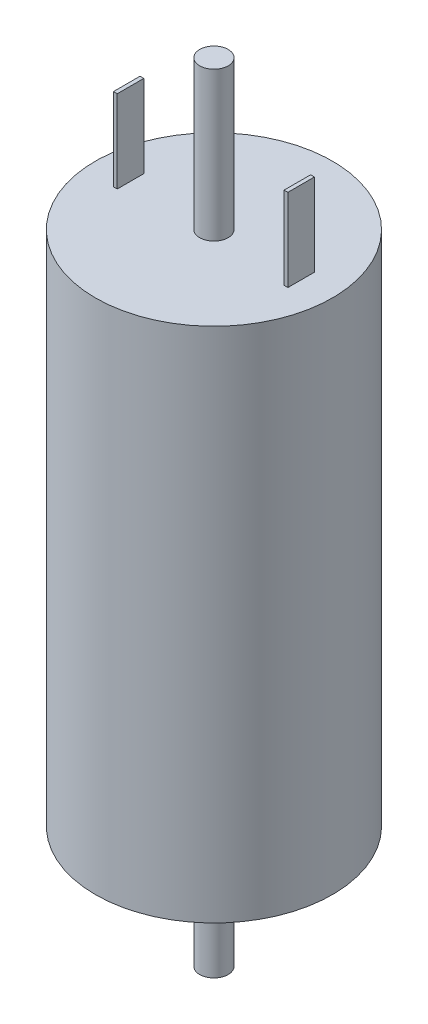
ISO-10303-21;
HEADER;
FILE_DESCRIPTION(('STEP AP214'),'2;1');
FILE_NAME('part.step','',(''),(''),'','','');
FILE_SCHEMA(('AUTOMOTIVE_DESIGN { 1 0 10303 214 1 1 1 1 }'));
ENDSEC;
DATA;
#1=APPLICATION_CONTEXT('core data for automotive mechanical design processes');
#2=APPLICATION_PROTOCOL_DEFINITION('international standard','automotive_design',2000,#1);
#3=PRODUCT_CONTEXT('',#1,'mechanical');
#4=PRODUCT('Part','Part','',(#3));
#5=PRODUCT_RELATED_PRODUCT_CATEGORY('part','',(#4));
#6=PRODUCT_DEFINITION_FORMATION('','',#4);
#7=PRODUCT_DEFINITION_CONTEXT('part definition',#1,'design');
#8=PRODUCT_DEFINITION('design','',#6,#7);
#9=PRODUCT_DEFINITION_SHAPE('','',#8);
#10=(LENGTH_UNIT() NAMED_UNIT(*) SI_UNIT(.MILLI.,.METRE.));
#11=(NAMED_UNIT(*) PLANE_ANGLE_UNIT() SI_UNIT($,.RADIAN.));
#12=(NAMED_UNIT(*) SI_UNIT($,.STERADIAN.) SOLID_ANGLE_UNIT());
#13=UNCERTAINTY_MEASURE_WITH_UNIT(LENGTH_MEASURE(1.E-05),#10,'distance_accuracy_value','');
#14=(GEOMETRIC_REPRESENTATION_CONTEXT(3) GLOBAL_UNCERTAINTY_ASSIGNED_CONTEXT((#13)) GLOBAL_UNIT_ASSIGNED_CONTEXT((#10,
#11,#12)) REPRESENTATION_CONTEXT('',''));
#15=CARTESIAN_POINT('',(0.,0.,0.));
#16=DIRECTION('',(0.,0.,1.));
#17=DIRECTION('',(1.,0.,0.));
#18=AXIS2_PLACEMENT_3D('',#15,#16,#17);
#19=CARTESIAN_POINT('',(0.,-54.5,0.));
#20=DIRECTION('',(0.,1.,0.));
#21=DIRECTION('',(0.,0.,1.));
#22=AXIS2_PLACEMENT_3D('',#19,#20,#21);
#23=PLANE('',#22);
#24=CARTESIAN_POINT('',(0.,-54.5,0.));
#25=DIRECTION('',(0.,1.,0.));
#26=DIRECTION('',(0.,0.,1.));
#27=AXIS2_PLACEMENT_3D('',#24,#25,#26);
#28=CIRCLE('',#27,12.5);
#29=CARTESIAN_POINT('',(0.,-54.5,12.5));
#30=VERTEX_POINT('',#29);
#31=EDGE_CURVE('E41',#30,#30,#28,.T.);
#32=ORIENTED_EDGE('',*,*,#31,.F.);
#33=EDGE_LOOP('',(#32));
#34=FACE_BOUND('',#33,.T.);
#35=CARTESIAN_POINT('',(0.,-54.5,8.5));
#36=DIRECTION('',(0.,-1.,0.));
#37=DIRECTION('',(0.,0.,-1.));
#38=AXIS2_PLACEMENT_3D('',#35,#36,#37);
#39=CIRCLE('',#38,1.);
#40=CARTESIAN_POINT('',(0.,-54.5,7.5));
#41=VERTEX_POINT('',#40);
#42=EDGE_CURVE('E194',#41,#41,#39,.T.);
#43=ORIENTED_EDGE('',*,*,#42,.F.);
#44=EDGE_LOOP('',(#43));
#45=FACE_BOUND('',#44,.T.);
#46=CARTESIAN_POINT('',(0.,-54.5,-8.5));
#47=DIRECTION('',(0.,-1.,0.));
#48=DIRECTION('',(0.,0.,-1.));
#49=AXIS2_PLACEMENT_3D('',#46,#47,#48);
#50=CIRCLE('',#49,1.);
#51=CARTESIAN_POINT('',(0.,-54.5,-9.5));
#52=VERTEX_POINT('',#51);
#53=EDGE_CURVE('E188',#52,#52,#50,.T.);
#54=ORIENTED_EDGE('',*,*,#53,.F.);
#55=EDGE_LOOP('',(#54));
#56=FACE_BOUND('',#55,.T.);
#57=CARTESIAN_POINT('',(-7.36121593216774,-54.5,-4.24999999999998));
#58=DIRECTION('',(0.,-1.,0.));
#59=DIRECTION('',(0.,0.,-1.));
#60=AXIS2_PLACEMENT_3D('',#57,#58,#59);
#61=CIRCLE('',#60,1.);
#62=CARTESIAN_POINT('',(-7.36121593216774,-54.5,-5.24999999999998));
#63=VERTEX_POINT('',#62);
#64=EDGE_CURVE('E183',#63,#63,#61,.T.);
#65=ORIENTED_EDGE('',*,*,#64,.F.);
#66=EDGE_LOOP('',(#65));
#67=FACE_BOUND('',#66,.T.);
#68=CARTESIAN_POINT('',(7.36121593216774,-54.5,-4.24999999999998));
#69=DIRECTION('',(0.,-1.,0.));
#70=DIRECTION('',(0.,0.,1.));
#71=AXIS2_PLACEMENT_3D('',#68,#69,#70);
#72=CIRCLE('',#71,1.);
#73=CARTESIAN_POINT('',(7.36121593216774,-54.5,-3.24999999999998));
#74=VERTEX_POINT('',#73);
#75=EDGE_CURVE('E170',#74,#74,#72,.T.);
#76=ORIENTED_EDGE('',*,*,#75,.F.);
#77=EDGE_LOOP('',(#76));
#78=FACE_BOUND('',#77,.T.);
#79=CARTESIAN_POINT('',(0.,-54.5,0.));
#80=DIRECTION('',(0.,1.,0.));
#81=DIRECTION('',(0.,0.,1.));
#82=AXIS2_PLACEMENT_3D('',#79,#80,#81);
#83=CIRCLE('',#82,5.);
#84=CARTESIAN_POINT('',(0.,-54.5,5.));
#85=VERTEX_POINT('',#84);
#86=EDGE_CURVE('E11',#85,#85,#83,.F.);
#87=ORIENTED_EDGE('',*,*,#86,.F.);
#88=EDGE_LOOP('',(#87));
#89=FACE_BOUND('',#88,.T.);
#90=ADVANCED_FACE('F33',(#34,#45,#56,#67,#78,#89),#23,.F.);
#91=CARTESIAN_POINT('',(0.,0.,0.));
#92=DIRECTION('',(0.,1.,0.));
#93=DIRECTION('',(0.,0.,1.));
#94=AXIS2_PLACEMENT_3D('',#91,#92,#93);
#95=PLANE('',#94);
#96=DIRECTION('',(-1.,0.,0.));
#97=VECTOR('',#96,1.);
#98=CARTESIAN_POINT('',(8.8,0.,-1.39999999999999));
#99=LINE('',#98,#97);
#100=CARTESIAN_POINT('',(9.2,0.,-1.39999999999999));
#101=VERTEX_POINT('',#100);
#102=CARTESIAN_POINT('',(8.8,0.,-1.39999999999999));
#103=VERTEX_POINT('',#102);
#104=EDGE_CURVE('E127',#101,#103,#99,.T.);
#105=ORIENTED_EDGE('',*,*,#104,.F.);
#106=DIRECTION('',(0.,0.,-1.));
#107=VECTOR('',#106,1.);
#108=CARTESIAN_POINT('',(9.2,0.,1.40000000000001));
#109=LINE('',#108,#107);
#110=CARTESIAN_POINT('',(9.2,0.,1.40000000000001));
#111=VERTEX_POINT('',#110);
#112=EDGE_CURVE('E124',#111,#101,#109,.T.);
#113=ORIENTED_EDGE('',*,*,#112,.F.);
#114=DIRECTION('',(1.,0.,0.));
#115=VECTOR('',#114,1.);
#116=CARTESIAN_POINT('',(8.8,0.,1.40000000000001));
#117=LINE('',#116,#115);
#118=CARTESIAN_POINT('',(8.8,0.,1.40000000000001));
#119=VERTEX_POINT('',#118);
#120=EDGE_CURVE('E136',#119,#111,#117,.T.);
#121=ORIENTED_EDGE('',*,*,#120,.F.);
#122=DIRECTION('',(0.,0.,1.));
#123=VECTOR('',#122,1.);
#124=CARTESIAN_POINT('',(8.8,0.,1.40000000000001));
#125=LINE('',#124,#123);
#126=EDGE_CURVE('E144',#103,#119,#125,.T.);
#127=ORIENTED_EDGE('',*,*,#126,.F.);
#128=EDGE_LOOP('',(#105,#113,#121,#127));
#129=FACE_BOUND('',#128,.T.);
#130=CARTESIAN_POINT('',(0.,0.,0.));
#131=DIRECTION('',(0.,1.,0.));
#132=DIRECTION('',(0.,0.,1.));
#133=AXIS2_PLACEMENT_3D('',#130,#131,#132);
#134=CIRCLE('',#133,12.5);
#135=CARTESIAN_POINT('',(0.,0.,12.5));
#136=VERTEX_POINT('',#135);
#137=EDGE_CURVE('E164',#136,#136,#134,.T.);
#138=ORIENTED_EDGE('',*,*,#137,.T.);
#139=EDGE_LOOP('',(#138));
#140=FACE_BOUND('',#139,.T.);
#141=CARTESIAN_POINT('',(0.,0.,0.));
#142=DIRECTION('',(0.,1.,0.));
#143=DIRECTION('',(0.,0.,1.));
#144=AXIS2_PLACEMENT_3D('',#141,#142,#143);
#145=CIRCLE('',#144,1.5);
#146=CARTESIAN_POINT('',(0.,0.,1.5));
#147=VERTEX_POINT('',#146);
#148=EDGE_CURVE('E155',#147,#147,#145,.T.);
#149=ORIENTED_EDGE('',*,*,#148,.F.);
#150=EDGE_LOOP('',(#149));
#151=FACE_BOUND('',#150,.T.);
#152=DIRECTION('',(0.,0.,-1.));
#153=VECTOR('',#152,1.);
#154=CARTESIAN_POINT('',(-8.8,0.,1.40000000000001));
#155=LINE('',#154,#153);
#156=CARTESIAN_POINT('',(-8.8,0.,1.40000000000001));
#157=VERTEX_POINT('',#156);
#158=CARTESIAN_POINT('',(-8.8,0.,-1.39999999999999));
#159=VERTEX_POINT('',#158);
#160=EDGE_CURVE('E206',#157,#159,#155,.T.);
#161=ORIENTED_EDGE('',*,*,#160,.F.);
#162=DIRECTION('',(1.,0.,0.));
#163=VECTOR('',#162,1.);
#164=CARTESIAN_POINT('',(-8.8,0.,1.40000000000001));
#165=LINE('',#164,#163);
#166=CARTESIAN_POINT('',(-9.2,0.,1.40000000000001));
#167=VERTEX_POINT('',#166);
#168=EDGE_CURVE('E122',#167,#157,#165,.T.);
#169=ORIENTED_EDGE('',*,*,#168,.F.);
#170=DIRECTION('',(0.,0.,1.));
#171=VECTOR('',#170,1.);
#172=CARTESIAN_POINT('',(-9.2,0.,1.40000000000001));
#173=LINE('',#172,#171);
#174=CARTESIAN_POINT('',(-9.2,0.,-1.39999999999999));
#175=VERTEX_POINT('',#174);
#176=EDGE_CURVE('E118',#175,#167,#173,.T.);
#177=ORIENTED_EDGE('',*,*,#176,.F.);
#178=DIRECTION('',(-1.,0.,0.));
#179=VECTOR('',#178,1.);
#180=CARTESIAN_POINT('',(-8.8,0.,-1.39999999999999));
#181=LINE('',#180,#179);
#182=EDGE_CURVE('E208',#159,#175,#181,.T.);
#183=ORIENTED_EDGE('',*,*,#182,.F.);
#184=EDGE_LOOP('',(#161,#169,#177,#183));
#185=FACE_BOUND('',#184,.T.);
#186=ADVANCED_FACE('F213',(#129,#140,#151,#185),#95,.T.);
#187=CARTESIAN_POINT('',(0.,-54.5,0.));
#188=DIRECTION('',(0.,1.,0.));
#189=DIRECTION('',(0.,0.,1.));
#190=AXIS2_PLACEMENT_3D('',#187,#188,#189);
#191=CYLINDRICAL_SURFACE('',#190,12.5);
#192=ORIENTED_EDGE('',*,*,#31,.T.);
#193=EDGE_LOOP('',(#192));
#194=FACE_BOUND('',#193,.T.);
#195=ORIENTED_EDGE('',*,*,#137,.F.);
#196=EDGE_LOOP('',(#195));
#197=FACE_BOUND('',#196,.T.);
#198=ADVANCED_FACE('F35',(#194,#197),#191,.T.);
#199=CARTESIAN_POINT('',(0.,15.7,0.));
#200=DIRECTION('',(0.,-1.,0.));
#201=DIRECTION('',(0.,0.,-1.));
#202=AXIS2_PLACEMENT_3D('',#199,#200,#201);
#203=CYLINDRICAL_SURFACE('',#202,1.5);
#204=CARTESIAN_POINT('',(0.,15.7,0.));
#205=DIRECTION('',(0.,1.,0.));
#206=DIRECTION('',(0.,0.,1.));
#207=AXIS2_PLACEMENT_3D('',#204,#205,#206);
#208=CIRCLE('',#207,1.5);
#209=CARTESIAN_POINT('',(0.,15.7,1.5));
#210=VERTEX_POINT('',#209);
#211=EDGE_CURVE('E156',#210,#210,#208,.T.);
#212=ORIENTED_EDGE('',*,*,#211,.F.);
#213=EDGE_LOOP('',(#212));
#214=FACE_BOUND('',#213,.T.);
#215=ORIENTED_EDGE('',*,*,#148,.T.);
#216=EDGE_LOOP('',(#215));
#217=FACE_BOUND('',#216,.T.);
#218=ADVANCED_FACE('F247',(#214,#217),#203,.T.);
#219=CARTESIAN_POINT('',(0.,15.7,0.));
#220=DIRECTION('',(0.,1.,0.));
#221=DIRECTION('',(0.,0.,1.));
#222=AXIS2_PLACEMENT_3D('',#219,#220,#221);
#223=PLANE('',#222);
#224=ORIENTED_EDGE('',*,*,#211,.T.);
#225=EDGE_LOOP('',(#224));
#226=FACE_BOUND('',#225,.T.);
#227=ADVANCED_FACE('F250',(#226),#223,.T.);
#228=CARTESIAN_POINT('',(9.2,8.7,1.40000000000001));
#229=DIRECTION('',(-1.,0.,0.));
#230=DIRECTION('',(0.,0.,1.));
#231=AXIS2_PLACEMENT_3D('',#228,#229,#230);
#232=PLANE('',#231);
#233=ORIENTED_EDGE('',*,*,#112,.T.);
#234=DIRECTION('',(0.,-1.,0.));
#235=VECTOR('',#234,1.);
#236=CARTESIAN_POINT('',(9.2,8.7,-1.39999999999999));
#237=LINE('',#236,#235);
#238=CARTESIAN_POINT('',(9.2,8.7,-1.39999999999999));
#239=VERTEX_POINT('',#238);
#240=EDGE_CURVE('E153',#239,#101,#237,.T.);
#241=ORIENTED_EDGE('',*,*,#240,.F.);
#242=DIRECTION('',(0.,0.,-1.));
#243=VECTOR('',#242,1.);
#244=CARTESIAN_POINT('',(9.2,8.7,1.40000000000001));
#245=LINE('',#244,#243);
#246=CARTESIAN_POINT('',(9.2,8.7,1.40000000000001));
#247=VERTEX_POINT('',#246);
#248=EDGE_CURVE('E132',#247,#239,#245,.T.);
#249=ORIENTED_EDGE('',*,*,#248,.F.);
#250=DIRECTION('',(0.,-1.,0.));
#251=VECTOR('',#250,1.);
#252=CARTESIAN_POINT('',(9.2,8.7,1.40000000000001));
#253=LINE('',#252,#251);
#254=EDGE_CURVE('E141',#247,#111,#253,.T.);
#255=ORIENTED_EDGE('',*,*,#254,.T.);
#256=EDGE_LOOP('',(#233,#241,#249,#255));
#257=FACE_BOUND('',#256,.T.);
#258=ADVANCED_FACE('F254',(#257),#232,.F.);
#259=CARTESIAN_POINT('',(8.8,8.7,-1.39999999999999));
#260=DIRECTION('',(0.,0.,1.));
#261=DIRECTION('',(1.,0.,0.));
#262=AXIS2_PLACEMENT_3D('',#259,#260,#261);
#263=PLANE('',#262);
#264=ORIENTED_EDGE('',*,*,#104,.T.);
#265=DIRECTION('',(0.,-1.,0.));
#266=VECTOR('',#265,1.);
#267=CARTESIAN_POINT('',(8.8,8.7,-1.39999999999999));
#268=LINE('',#267,#266);
#269=CARTESIAN_POINT('',(8.8,8.7,-1.39999999999999));
#270=VERTEX_POINT('',#269);
#271=EDGE_CURVE('E150',#270,#103,#268,.T.);
#272=ORIENTED_EDGE('',*,*,#271,.F.);
#273=DIRECTION('',(-1.,0.,0.));
#274=VECTOR('',#273,1.);
#275=CARTESIAN_POINT('',(8.8,8.7,-1.39999999999999));
#276=LINE('',#275,#274);
#277=EDGE_CURVE('E135',#239,#270,#276,.T.);
#278=ORIENTED_EDGE('',*,*,#277,.F.);
#279=ORIENTED_EDGE('',*,*,#240,.T.);
#280=EDGE_LOOP('',(#264,#272,#278,#279));
#281=FACE_BOUND('',#280,.T.);
#282=ADVANCED_FACE('F258',(#281),#263,.F.);
#283=CARTESIAN_POINT('',(8.8,8.7,1.40000000000001));
#284=DIRECTION('',(1.,0.,0.));
#285=DIRECTION('',(0.,0.,-1.));
#286=AXIS2_PLACEMENT_3D('',#283,#284,#285);
#287=PLANE('',#286);
#288=ORIENTED_EDGE('',*,*,#126,.T.);
#289=DIRECTION('',(0.,-1.,0.));
#290=VECTOR('',#289,1.);
#291=CARTESIAN_POINT('',(8.8,8.7,1.40000000000001));
#292=LINE('',#291,#290);
#293=CARTESIAN_POINT('',(8.8,8.7,1.40000000000001));
#294=VERTEX_POINT('',#293);
#295=EDGE_CURVE('E56',#294,#119,#292,.T.);
#296=ORIENTED_EDGE('',*,*,#295,.F.);
#297=DIRECTION('',(0.,0.,1.));
#298=VECTOR('',#297,1.);
#299=CARTESIAN_POINT('',(8.8,8.7,1.40000000000001));
#300=LINE('',#299,#298);
#301=EDGE_CURVE('E138',#270,#294,#300,.T.);
#302=ORIENTED_EDGE('',*,*,#301,.F.);
#303=ORIENTED_EDGE('',*,*,#271,.T.);
#304=EDGE_LOOP('',(#288,#296,#302,#303));
#305=FACE_BOUND('',#304,.T.);
#306=ADVANCED_FACE('F262',(#305),#287,.F.);
#307=CARTESIAN_POINT('',(8.8,8.7,1.40000000000001));
#308=DIRECTION('',(0.,0.,-1.));
#309=DIRECTION('',(-1.,0.,0.));
#310=AXIS2_PLACEMENT_3D('',#307,#308,#309);
#311=PLANE('',#310);
#312=ORIENTED_EDGE('',*,*,#120,.T.);
#313=ORIENTED_EDGE('',*,*,#254,.F.);
#314=DIRECTION('',(1.,0.,0.));
#315=VECTOR('',#314,1.);
#316=CARTESIAN_POINT('',(8.8,8.7,1.40000000000001));
#317=LINE('',#316,#315);
#318=EDGE_CURVE('E140',#294,#247,#317,.T.);
#319=ORIENTED_EDGE('',*,*,#318,.F.);
#320=ORIENTED_EDGE('',*,*,#295,.T.);
#321=EDGE_LOOP('',(#312,#313,#319,#320));
#322=FACE_BOUND('',#321,.T.);
#323=ADVANCED_FACE('F266',(#322),#311,.F.);
#324=CARTESIAN_POINT('',(0.,8.7,0.));
#325=DIRECTION('',(0.,-1.,0.));
#326=DIRECTION('',(0.,0.,-1.));
#327=AXIS2_PLACEMENT_3D('',#324,#325,#326);
#328=PLANE('',#327);
#329=ORIENTED_EDGE('',*,*,#248,.T.);
#330=ORIENTED_EDGE('',*,*,#277,.T.);
#331=ORIENTED_EDGE('',*,*,#301,.T.);
#332=ORIENTED_EDGE('',*,*,#318,.T.);
#333=EDGE_LOOP('',(#329,#330,#331,#332));
#334=FACE_BOUND('',#333,.T.);
#335=ADVANCED_FACE('F270',(#334),#328,.F.);
#336=CARTESIAN_POINT('',(-8.8,8.7,1.40000000000001));
#337=DIRECTION('',(0.,0.,-1.));
#338=DIRECTION('',(-1.,0.,0.));
#339=AXIS2_PLACEMENT_3D('',#336,#337,#338);
#340=PLANE('',#339);
#341=ORIENTED_EDGE('',*,*,#168,.T.);
#342=DIRECTION('',(0.,-1.,0.));
#343=VECTOR('',#342,1.);
#344=CARTESIAN_POINT('',(-8.8,8.7,1.40000000000001));
#345=LINE('',#344,#343);
#346=CARTESIAN_POINT('',(-8.8,8.7,1.40000000000001));
#347=VERTEX_POINT('',#346);
#348=EDGE_CURVE('E103',#347,#157,#345,.T.);
#349=ORIENTED_EDGE('',*,*,#348,.F.);
#350=DIRECTION('',(1.,0.,0.));
#351=VECTOR('',#350,1.);
#352=CARTESIAN_POINT('',(-8.8,8.7,1.40000000000001));
#353=LINE('',#352,#351);
#354=CARTESIAN_POINT('',(-9.2,8.7,1.40000000000001));
#355=VERTEX_POINT('',#354);
#356=EDGE_CURVE('E110',#355,#347,#353,.T.);
#357=ORIENTED_EDGE('',*,*,#356,.F.);
#358=DIRECTION('',(0.,-1.,0.));
#359=VECTOR('',#358,1.);
#360=CARTESIAN_POINT('',(-9.2,8.7,1.40000000000001));
#361=LINE('',#360,#359);
#362=EDGE_CURVE('E204',#355,#167,#361,.T.);
#363=ORIENTED_EDGE('',*,*,#362,.T.);
#364=EDGE_LOOP('',(#341,#349,#357,#363));
#365=FACE_BOUND('',#364,.T.);
#366=ADVANCED_FACE('F120',(#365),#340,.F.);
#367=CARTESIAN_POINT('',(-8.8,8.7,1.40000000000001));
#368=DIRECTION('',(-1.,0.,0.));
#369=DIRECTION('',(0.,0.,1.));
#370=AXIS2_PLACEMENT_3D('',#367,#368,#369);
#371=PLANE('',#370);
#372=ORIENTED_EDGE('',*,*,#160,.T.);
#373=DIRECTION('',(0.,-1.,0.));
#374=VECTOR('',#373,1.);
#375=CARTESIAN_POINT('',(-8.8,8.7,-1.39999999999999));
#376=LINE('',#375,#374);
#377=CARTESIAN_POINT('',(-8.8,8.7,-1.39999999999999));
#378=VERTEX_POINT('',#377);
#379=EDGE_CURVE('E106',#378,#159,#376,.T.);
#380=ORIENTED_EDGE('',*,*,#379,.F.);
#381=DIRECTION('',(0.,0.,-1.));
#382=VECTOR('',#381,1.);
#383=CARTESIAN_POINT('',(-8.8,8.7,1.40000000000001));
#384=LINE('',#383,#382);
#385=EDGE_CURVE('E99',#347,#378,#384,.T.);
#386=ORIENTED_EDGE('',*,*,#385,.F.);
#387=ORIENTED_EDGE('',*,*,#348,.T.);
#388=EDGE_LOOP('',(#372,#380,#386,#387));
#389=FACE_BOUND('',#388,.T.);
#390=ADVANCED_FACE('F101',(#389),#371,.F.);
#391=CARTESIAN_POINT('',(-8.8,8.7,-1.39999999999999));
#392=DIRECTION('',(0.,0.,1.));
#393=DIRECTION('',(1.,0.,0.));
#394=AXIS2_PLACEMENT_3D('',#391,#392,#393);
#395=PLANE('',#394);
#396=ORIENTED_EDGE('',*,*,#182,.T.);
#397=DIRECTION('',(0.,-1.,0.));
#398=VECTOR('',#397,1.);
#399=CARTESIAN_POINT('',(-9.2,8.7,-1.39999999999999));
#400=LINE('',#399,#398);
#401=CARTESIAN_POINT('',(-9.2,8.7,-1.39999999999999));
#402=VERTEX_POINT('',#401);
#403=EDGE_CURVE('E48',#402,#175,#400,.T.);
#404=ORIENTED_EDGE('',*,*,#403,.F.);
#405=DIRECTION('',(-1.,0.,0.));
#406=VECTOR('',#405,1.);
#407=CARTESIAN_POINT('',(-8.8,8.7,-1.39999999999999));
#408=LINE('',#407,#406);
#409=EDGE_CURVE('E109',#378,#402,#408,.T.);
#410=ORIENTED_EDGE('',*,*,#409,.F.);
#411=ORIENTED_EDGE('',*,*,#379,.T.);
#412=EDGE_LOOP('',(#396,#404,#410,#411));
#413=FACE_BOUND('',#412,.T.);
#414=ADVANCED_FACE('F216',(#413),#395,.F.);
#415=CARTESIAN_POINT('',(-9.2,8.7,1.40000000000001));
#416=DIRECTION('',(1.,0.,0.));
#417=DIRECTION('',(0.,0.,-1.));
#418=AXIS2_PLACEMENT_3D('',#415,#416,#417);
#419=PLANE('',#418);
#420=ORIENTED_EDGE('',*,*,#176,.T.);
#421=ORIENTED_EDGE('',*,*,#362,.F.);
#422=DIRECTION('',(0.,0.,1.));
#423=VECTOR('',#422,1.);
#424=CARTESIAN_POINT('',(-9.2,8.7,1.40000000000001));
#425=LINE('',#424,#423);
#426=EDGE_CURVE('E114',#402,#355,#425,.T.);
#427=ORIENTED_EDGE('',*,*,#426,.F.);
#428=ORIENTED_EDGE('',*,*,#403,.T.);
#429=EDGE_LOOP('',(#420,#421,#427,#428));
#430=FACE_BOUND('',#429,.T.);
#431=ADVANCED_FACE('F217',(#430),#419,.F.);
#432=CARTESIAN_POINT('',(0.,8.7,0.));
#433=DIRECTION('',(0.,-1.,0.));
#434=DIRECTION('',(0.,0.,-1.));
#435=AXIS2_PLACEMENT_3D('',#432,#433,#434);
#436=PLANE('',#435);
#437=ORIENTED_EDGE('',*,*,#356,.T.);
#438=ORIENTED_EDGE('',*,*,#385,.T.);
#439=ORIENTED_EDGE('',*,*,#409,.T.);
#440=ORIENTED_EDGE('',*,*,#426,.T.);
#441=EDGE_LOOP('',(#437,#438,#439,#440));
#442=FACE_BOUND('',#441,.T.);
#443=ADVANCED_FACE('F113',(#442),#436,.F.);
#444=CARTESIAN_POINT('',(0.,-51.6,8.5));
#445=DIRECTION('',(0.,-1.,0.));
#446=DIRECTION('',(0.,0.,-1.));
#447=AXIS2_PLACEMENT_3D('',#444,#445,#446);
#448=CYLINDRICAL_SURFACE('',#447,1.);
#449=CARTESIAN_POINT('',(0.,-51.6,8.5));
#450=DIRECTION('',(0.,-1.,0.));
#451=DIRECTION('',(0.,0.,-1.));
#452=AXIS2_PLACEMENT_3D('',#449,#450,#451);
#453=CIRCLE('',#452,1.);
#454=CARTESIAN_POINT('',(0.,-51.6,7.5));
#455=VERTEX_POINT('',#454);
#456=EDGE_CURVE('E197',#455,#455,#453,.T.);
#457=ORIENTED_EDGE('',*,*,#456,.F.);
#458=EDGE_LOOP('',(#457));
#459=FACE_BOUND('',#458,.T.);
#460=ORIENTED_EDGE('',*,*,#42,.T.);
#461=EDGE_LOOP('',(#460));
#462=FACE_BOUND('',#461,.T.);
#463=ADVANCED_FACE('F224',(#459,#462),#448,.F.);
#464=CARTESIAN_POINT('',(0.,-51.6,8.5));
#465=DIRECTION('',(0.,-1.,0.));
#466=DIRECTION('',(0.,0.,-1.));
#467=AXIS2_PLACEMENT_3D('',#464,#465,#466);
#468=PLANE('',#467);
#469=ORIENTED_EDGE('',*,*,#456,.T.);
#470=EDGE_LOOP('',(#469));
#471=FACE_BOUND('',#470,.T.);
#472=ADVANCED_FACE('F304',(#471),#468,.T.);
#473=CARTESIAN_POINT('',(0.,-51.6,-8.5));
#474=DIRECTION('',(0.,-1.,0.));
#475=DIRECTION('',(0.,0.,-1.));
#476=AXIS2_PLACEMENT_3D('',#473,#474,#475);
#477=CYLINDRICAL_SURFACE('',#476,1.);
#478=CARTESIAN_POINT('',(0.,-51.6,-8.5));
#479=DIRECTION('',(0.,-1.,0.));
#480=DIRECTION('',(0.,0.,-1.));
#481=AXIS2_PLACEMENT_3D('',#478,#479,#480);
#482=CIRCLE('',#481,1.);
#483=CARTESIAN_POINT('',(0.,-51.6,-9.5));
#484=VERTEX_POINT('',#483);
#485=EDGE_CURVE('E191',#484,#484,#482,.T.);
#486=ORIENTED_EDGE('',*,*,#485,.F.);
#487=EDGE_LOOP('',(#486));
#488=FACE_BOUND('',#487,.T.);
#489=ORIENTED_EDGE('',*,*,#53,.T.);
#490=EDGE_LOOP('',(#489));
#491=FACE_BOUND('',#490,.T.);
#492=ADVANCED_FACE('F314',(#488,#491),#477,.F.);
#493=CARTESIAN_POINT('',(0.,-51.6,-8.5));
#494=DIRECTION('',(0.,-1.,0.));
#495=DIRECTION('',(0.,0.,-1.));
#496=AXIS2_PLACEMENT_3D('',#493,#494,#495);
#497=PLANE('',#496);
#498=ORIENTED_EDGE('',*,*,#485,.T.);
#499=EDGE_LOOP('',(#498));
#500=FACE_BOUND('',#499,.T.);
#501=ADVANCED_FACE('F324',(#500),#497,.T.);
#502=CARTESIAN_POINT('',(-7.36121593216774,-51.6,-4.24999999999998));
#503=DIRECTION('',(0.,-1.,0.));
#504=DIRECTION('',(0.,0.,-1.));
#505=AXIS2_PLACEMENT_3D('',#502,#503,#504);
#506=CYLINDRICAL_SURFACE('',#505,1.);
#507=CARTESIAN_POINT('',(-7.36121593216774,-51.6,-4.24999999999998));
#508=DIRECTION('',(0.,-1.,0.));
#509=DIRECTION('',(0.,0.,-1.));
#510=AXIS2_PLACEMENT_3D('',#507,#508,#509);
#511=CIRCLE('',#510,1.);
#512=CARTESIAN_POINT('',(-7.36121593216774,-51.6,-5.24999999999998));
#513=VERTEX_POINT('',#512);
#514=EDGE_CURVE('E185',#513,#513,#511,.T.);
#515=ORIENTED_EDGE('',*,*,#514,.F.);
#516=EDGE_LOOP('',(#515));
#517=FACE_BOUND('',#516,.T.);
#518=ORIENTED_EDGE('',*,*,#64,.T.);
#519=EDGE_LOOP('',(#518));
#520=FACE_BOUND('',#519,.T.);
#521=ADVANCED_FACE('F334',(#517,#520),#506,.F.);
#522=CARTESIAN_POINT('',(-7.36121593216774,-51.6,-4.24999999999998));
#523=DIRECTION('',(0.,-1.,0.));
#524=DIRECTION('',(0.,0.,-1.));
#525=AXIS2_PLACEMENT_3D('',#522,#523,#524);
#526=PLANE('',#525);
#527=ORIENTED_EDGE('',*,*,#514,.T.);
#528=EDGE_LOOP('',(#527));
#529=FACE_BOUND('',#528,.T.);
#530=ADVANCED_FACE('F344',(#529),#526,.T.);
#531=CARTESIAN_POINT('',(7.36121593216774,-51.6,-4.24999999999998));
#532=DIRECTION('',(0.,-1.,0.));
#533=DIRECTION('',(0.,0.,-1.));
#534=AXIS2_PLACEMENT_3D('',#531,#532,#533);
#535=CYLINDRICAL_SURFACE('',#534,1.);
#536=CARTESIAN_POINT('',(7.36121593216774,-51.6,-4.24999999999998));
#537=DIRECTION('',(0.,-1.,0.));
#538=DIRECTION('',(0.,0.,1.));
#539=AXIS2_PLACEMENT_3D('',#536,#537,#538);
#540=CIRCLE('',#539,1.);
#541=CARTESIAN_POINT('',(7.36121593216774,-51.6,-3.24999999999998));
#542=VERTEX_POINT('',#541);
#543=EDGE_CURVE('E175',#542,#542,#540,.T.);
#544=ORIENTED_EDGE('',*,*,#543,.F.);
#545=EDGE_LOOP('',(#544));
#546=FACE_BOUND('',#545,.T.);
#547=ORIENTED_EDGE('',*,*,#75,.T.);
#548=EDGE_LOOP('',(#547));
#549=FACE_BOUND('',#548,.T.);
#550=ADVANCED_FACE('F354',(#546,#549),#535,.F.);
#551=CARTESIAN_POINT('',(7.36121593216774,-51.6,-4.24999999999998));
#552=DIRECTION('',(0.,1.,0.));
#553=DIRECTION('',(0.,0.,1.));
#554=AXIS2_PLACEMENT_3D('',#551,#552,#553);
#555=PLANE('',#554);
#556=ORIENTED_EDGE('',*,*,#543,.T.);
#557=EDGE_LOOP('',(#556));
#558=FACE_BOUND('',#557,.T.);
#559=ADVANCED_FACE('F363',(#558),#555,.F.);
#560=CARTESIAN_POINT('',(0.,-57.4,0.));
#561=DIRECTION('',(0.,-1.,0.));
#562=DIRECTION('',(0.,0.,-1.));
#563=AXIS2_PLACEMENT_3D('',#560,#561,#562);
#564=PLANE('',#563);
#565=CARTESIAN_POINT('',(0.,-57.4,0.));
#566=DIRECTION('',(0.,-1.,0.));
#567=DIRECTION('',(0.,0.,-1.));
#568=AXIS2_PLACEMENT_3D('',#565,#566,#567);
#569=CIRCLE('',#568,5.);
#570=CARTESIAN_POINT('',(0.,-57.4,-5.));
#571=VERTEX_POINT('',#570);
#572=EDGE_CURVE('E171',#571,#571,#569,.T.);
#573=ORIENTED_EDGE('',*,*,#572,.T.);
#574=EDGE_LOOP('',(#573));
#575=FACE_BOUND('',#574,.T.);
#576=CARTESIAN_POINT('',(0.,-57.4,0.));
#577=DIRECTION('',(0.,-1.,0.));
#578=DIRECTION('',(0.,0.,-1.));
#579=AXIS2_PLACEMENT_3D('',#576,#577,#578);
#580=CIRCLE('',#579,1.5);
#581=CARTESIAN_POINT('',(0.,-57.4,-1.5));
#582=VERTEX_POINT('',#581);
#583=EDGE_CURVE('E168',#582,#582,#580,.T.);
#584=ORIENTED_EDGE('',*,*,#583,.F.);
#585=EDGE_LOOP('',(#584));
#586=FACE_BOUND('',#585,.T.);
#587=ADVANCED_FACE('F372',(#575,#586),#564,.T.);
#588=CARTESIAN_POINT('',(0.,-57.4,0.));
#589=DIRECTION('',(0.,1.,0.));
#590=DIRECTION('',(0.,0.,1.));
#591=AXIS2_PLACEMENT_3D('',#588,#589,#590);
#592=CYLINDRICAL_SURFACE('',#591,5.);
#593=ORIENTED_EDGE('',*,*,#572,.F.);
#594=EDGE_LOOP('',(#593));
#595=FACE_BOUND('',#594,.T.);
#596=ORIENTED_EDGE('',*,*,#86,.T.);
#597=EDGE_LOOP('',(#596));
#598=FACE_BOUND('',#597,.T.);
#599=ADVANCED_FACE('F245',(#595,#598),#592,.T.);
#600=CARTESIAN_POINT('',(0.,-67.3,0.));
#601=DIRECTION('',(0.,-1.,0.));
#602=DIRECTION('',(0.,0.,-1.));
#603=AXIS2_PLACEMENT_3D('',#600,#601,#602);
#604=PLANE('',#603);
#605=CARTESIAN_POINT('',(0.,-67.3,0.));
#606=DIRECTION('',(0.,-1.,0.));
#607=DIRECTION('',(0.,0.,-1.));
#608=AXIS2_PLACEMENT_3D('',#605,#606,#607);
#609=CIRCLE('',#608,1.5);
#610=CARTESIAN_POINT('',(0.,-67.3,-1.5));
#611=VERTEX_POINT('',#610);
#612=EDGE_CURVE('E159',#611,#611,#609,.T.);
#613=ORIENTED_EDGE('',*,*,#612,.T.);
#614=EDGE_LOOP('',(#613));
#615=FACE_BOUND('',#614,.T.);
#616=ADVANCED_FACE('F242',(#615),#604,.T.);
#617=CARTESIAN_POINT('',(0.,-67.3,0.));
#618=DIRECTION('',(0.,1.,0.));
#619=DIRECTION('',(0.,0.,1.));
#620=AXIS2_PLACEMENT_3D('',#617,#618,#619);
#621=CYLINDRICAL_SURFACE('',#620,1.5);
#622=ORIENTED_EDGE('',*,*,#583,.T.);
#623=EDGE_LOOP('',(#622));
#624=FACE_BOUND('',#623,.T.);
#625=ORIENTED_EDGE('',*,*,#612,.F.);
#626=EDGE_LOOP('',(#625));
#627=FACE_BOUND('',#626,.T.);
#628=ADVANCED_FACE('F239',(#624,#627),#621,.T.);
#629=CLOSED_SHELL('',(#90,#186,#198,#218,#227,#258,#282,#306,#323,#335,#366,#390,#414,#431,#443,
#463,#472,#492,#501,#521,#530,#550,#559,#587,#599,#616,#628));
#630=MANIFOLD_SOLID_BREP('B2',#629);
#631=ADVANCED_BREP_SHAPE_REPRESENTATION('',(#18,#630),#14);
#632=SHAPE_DEFINITION_REPRESENTATION(#9,#631);
ENDSEC;
END-ISO-10303-21;
